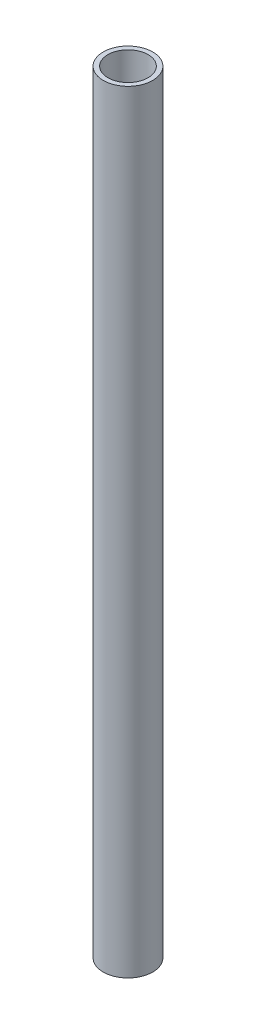
ISO-10303-21;
HEADER;
FILE_DESCRIPTION(('STEP AP214'),'2;1');
FILE_NAME('part.step','',(''),(''),'','','');
FILE_SCHEMA(('AUTOMOTIVE_DESIGN { 1 0 10303 214 1 1 1 1 }'));
ENDSEC;
DATA;
#1=APPLICATION_CONTEXT('core data for automotive mechanical design processes');
#2=APPLICATION_PROTOCOL_DEFINITION('international standard','automotive_design',2000,#1);
#3=PRODUCT_CONTEXT('',#1,'mechanical');
#4=PRODUCT('Part','Part','',(#3));
#5=PRODUCT_RELATED_PRODUCT_CATEGORY('part','',(#4));
#6=PRODUCT_DEFINITION_FORMATION('','',#4);
#7=PRODUCT_DEFINITION_CONTEXT('part definition',#1,'design');
#8=PRODUCT_DEFINITION('design','',#6,#7);
#9=PRODUCT_DEFINITION_SHAPE('','',#8);
#10=(LENGTH_UNIT() NAMED_UNIT(*) SI_UNIT(.MILLI.,.METRE.));
#11=(NAMED_UNIT(*) PLANE_ANGLE_UNIT() SI_UNIT($,.RADIAN.));
#12=(NAMED_UNIT(*) SI_UNIT($,.STERADIAN.) SOLID_ANGLE_UNIT());
#13=UNCERTAINTY_MEASURE_WITH_UNIT(LENGTH_MEASURE(1.E-05),#10,'distance_accuracy_value','');
#14=(GEOMETRIC_REPRESENTATION_CONTEXT(3) GLOBAL_UNCERTAINTY_ASSIGNED_CONTEXT((#13)) GLOBAL_UNIT_ASSIGNED_CONTEXT((#10,
#11,#12)) REPRESENTATION_CONTEXT('',''));
#15=CARTESIAN_POINT('',(0.,0.,0.));
#16=DIRECTION('',(0.,0.,1.));
#17=DIRECTION('',(1.,0.,0.));
#18=AXIS2_PLACEMENT_3D('',#15,#16,#17);
#19=CARTESIAN_POINT('',(0.,250.,0.));
#20=DIRECTION('',(0.,1.,0.));
#21=DIRECTION('',(0.,0.,1.));
#22=AXIS2_PLACEMENT_3D('',#19,#20,#21);
#23=PLANE('',#22);
#24=CARTESIAN_POINT('',(0.,250.,0.));
#25=DIRECTION('',(0.,1.,0.));
#26=DIRECTION('',(0.,0.,1.));
#27=AXIS2_PLACEMENT_3D('',#24,#25,#26);
#28=CIRCLE('',#27,8.);
#29=CARTESIAN_POINT('',(0.,250.,8.));
#30=VERTEX_POINT('',#29);
#31=EDGE_CURVE('E10',#30,#30,#28,.T.);
#32=ORIENTED_EDGE('',*,*,#31,.T.);
#33=EDGE_LOOP('',(#32));
#34=FACE_BOUND('',#33,.T.);
#35=CARTESIAN_POINT('',(0.,250.,0.));
#36=DIRECTION('',(0.,1.,0.));
#37=DIRECTION('',(0.,0.,1.));
#38=AXIS2_PLACEMENT_3D('',#35,#36,#37);
#39=CIRCLE('',#38,6.5);
#40=CARTESIAN_POINT('',(0.,250.,6.5));
#41=VERTEX_POINT('',#40);
#42=EDGE_CURVE('E48',#41,#41,#39,.T.);
#43=ORIENTED_EDGE('',*,*,#42,.F.);
#44=EDGE_LOOP('',(#43));
#45=FACE_BOUND('',#44,.T.);
#46=ADVANCED_FACE('F37',(#34,#45),#23,.T.);
#47=CARTESIAN_POINT('',(0.,0.,0.));
#48=DIRECTION('',(0.,1.,0.));
#49=DIRECTION('',(0.,0.,1.));
#50=AXIS2_PLACEMENT_3D('',#47,#48,#49);
#51=PLANE('',#50);
#52=CARTESIAN_POINT('',(0.,0.,0.));
#53=DIRECTION('',(0.,1.,0.));
#54=DIRECTION('',(0.,0.,1.));
#55=AXIS2_PLACEMENT_3D('',#52,#53,#54);
#56=CIRCLE('',#55,8.);
#57=CARTESIAN_POINT('',(0.,0.,8.));
#58=VERTEX_POINT('',#57);
#59=EDGE_CURVE('E41',#58,#58,#56,.T.);
#60=ORIENTED_EDGE('',*,*,#59,.F.);
#61=EDGE_LOOP('',(#60));
#62=FACE_BOUND('',#61,.T.);
#63=CARTESIAN_POINT('',(0.,0.,0.));
#64=DIRECTION('',(0.,1.,0.));
#65=DIRECTION('',(0.,0.,1.));
#66=AXIS2_PLACEMENT_3D('',#63,#64,#65);
#67=CIRCLE('',#66,6.5);
#68=CARTESIAN_POINT('',(0.,0.,6.5));
#69=VERTEX_POINT('',#68);
#70=EDGE_CURVE('E50',#69,#69,#67,.T.);
#71=ORIENTED_EDGE('',*,*,#70,.T.);
#72=EDGE_LOOP('',(#71));
#73=FACE_BOUND('',#72,.T.);
#74=ADVANCED_FACE('F60',(#62,#73),#51,.F.);
#75=CARTESIAN_POINT('',(0.,250.,0.));
#76=DIRECTION('',(0.,-1.,0.));
#77=DIRECTION('',(0.,0.,-1.));
#78=AXIS2_PLACEMENT_3D('',#75,#76,#77);
#79=CYLINDRICAL_SURFACE('',#78,8.);
#80=ORIENTED_EDGE('',*,*,#31,.F.);
#81=EDGE_LOOP('',(#80));
#82=FACE_BOUND('',#81,.T.);
#83=ORIENTED_EDGE('',*,*,#59,.T.);
#84=EDGE_LOOP('',(#83));
#85=FACE_BOUND('',#84,.T.);
#86=ADVANCED_FACE('F39',(#82,#85),#79,.T.);
#87=CARTESIAN_POINT('',(0.,250.,0.));
#88=DIRECTION('',(0.,-1.,0.));
#89=DIRECTION('',(0.,0.,-1.));
#90=AXIS2_PLACEMENT_3D('',#87,#88,#89);
#91=CYLINDRICAL_SURFACE('',#90,6.5);
#92=ORIENTED_EDGE('',*,*,#42,.T.);
#93=EDGE_LOOP('',(#92));
#94=FACE_BOUND('',#93,.T.);
#95=ORIENTED_EDGE('',*,*,#70,.F.);
#96=EDGE_LOOP('',(#95));
#97=FACE_BOUND('',#96,.T.);
#98=ADVANCED_FACE('F56',(#94,#97),#91,.F.);
#99=CLOSED_SHELL('',(#46,#74,#86,#98));
#100=MANIFOLD_SOLID_BREP('B2',#99);
#101=ADVANCED_BREP_SHAPE_REPRESENTATION('',(#18,#100),#14);
#102=SHAPE_DEFINITION_REPRESENTATION(#9,#101);
ENDSEC;
END-ISO-10303-21;
